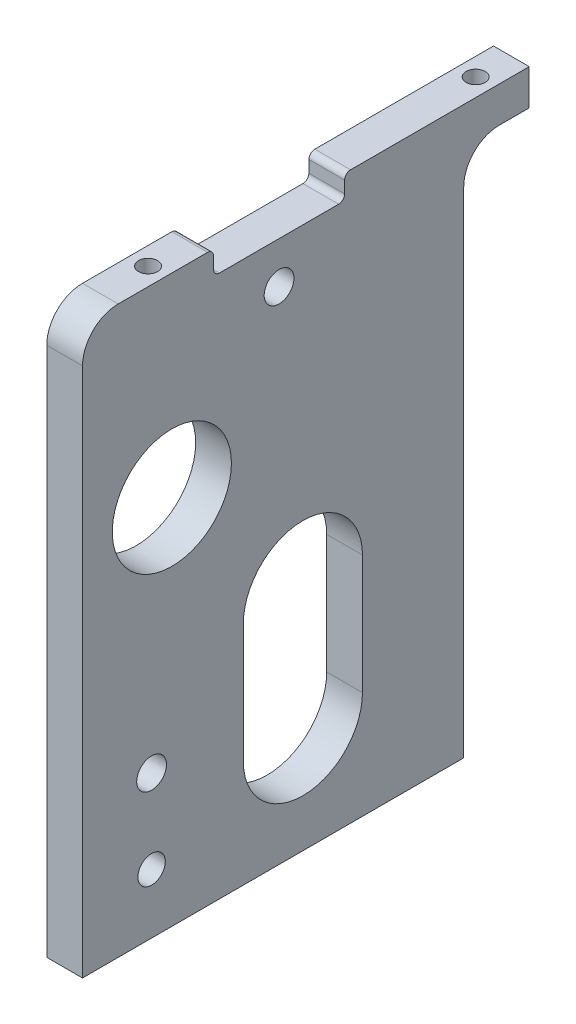
ISO-10303-21;
HEADER;
FILE_DESCRIPTION(('STEP AP214'),'2;1');
FILE_NAME('part.step','',(''),(''),'','','');
FILE_SCHEMA(('AUTOMOTIVE_DESIGN { 1 0 10303 214 1 1 1 1 }'));
ENDSEC;
DATA;
#1=APPLICATION_CONTEXT('core data for automotive mechanical design processes');
#2=APPLICATION_PROTOCOL_DEFINITION('international standard','automotive_design',2000,#1);
#3=PRODUCT_CONTEXT('',#1,'mechanical');
#4=PRODUCT('Part','Part','',(#3));
#5=PRODUCT_RELATED_PRODUCT_CATEGORY('part','',(#4));
#6=PRODUCT_DEFINITION_FORMATION('','',#4);
#7=PRODUCT_DEFINITION_CONTEXT('part definition',#1,'design');
#8=PRODUCT_DEFINITION('design','',#6,#7);
#9=PRODUCT_DEFINITION_SHAPE('','',#8);
#10=(LENGTH_UNIT() NAMED_UNIT(*) SI_UNIT(.MILLI.,.METRE.));
#11=(NAMED_UNIT(*) PLANE_ANGLE_UNIT() SI_UNIT($,.RADIAN.));
#12=(NAMED_UNIT(*) SI_UNIT($,.STERADIAN.) SOLID_ANGLE_UNIT());
#13=UNCERTAINTY_MEASURE_WITH_UNIT(LENGTH_MEASURE(1.E-05),#10,'distance_accuracy_value','');
#14=(GEOMETRIC_REPRESENTATION_CONTEXT(3) GLOBAL_UNCERTAINTY_ASSIGNED_CONTEXT((#13)) GLOBAL_UNIT_ASSIGNED_CONTEXT((#10,
#11,#12)) REPRESENTATION_CONTEXT('',''));
#15=CARTESIAN_POINT('',(0.,0.,0.));
#16=DIRECTION('',(0.,0.,1.));
#17=DIRECTION('',(1.,0.,0.));
#18=AXIS2_PLACEMENT_3D('',#15,#16,#17);
#19=CARTESIAN_POINT('',(1.5,23.75,16.5));
#20=DIRECTION('',(0.,-1.,0.));
#21=DIRECTION('',(0.,0.,-1.));
#22=AXIS2_PLACEMENT_3D('',#19,#20,#21);
#23=PLANE('',#22);
#24=CARTESIAN_POINT('',(0.,23.75,9.49999999999999));
#25=DIRECTION('',(0.,1.,0.));
#26=DIRECTION('',(0.,0.,1.));
#27=AXIS2_PLACEMENT_3D('',#24,#25,#26);
#28=CIRCLE('',#27,0.799999999999999);
#29=CARTESIAN_POINT('',(0.,23.75,10.3));
#30=VERTEX_POINT('',#29);
#31=EDGE_CURVE('E203',#30,#30,#28,.T.);
#32=ORIENTED_EDGE('',*,*,#31,.F.);
#33=EDGE_LOOP('',(#32));
#34=FACE_BOUND('',#33,.T.);
#35=DIRECTION('',(0.,0.,1.));
#36=VECTOR('',#35,1.);
#37=CARTESIAN_POINT('',(1.5,23.75,-15.5));
#38=LINE('',#37,#36);
#39=CARTESIAN_POINT('',(1.5,23.75,5.99999999999998));
#40=VERTEX_POINT('',#39);
#41=CARTESIAN_POINT('',(1.5,23.75,13.5));
#42=VERTEX_POINT('',#41);
#43=EDGE_CURVE('E293',#40,#42,#38,.T.);
#44=ORIENTED_EDGE('',*,*,#43,.F.);
#45=DIRECTION('',(1.,0.,0.));
#46=VECTOR('',#45,1.);
#47=CARTESIAN_POINT('',(1.5,23.75,5.99999999999998));
#48=LINE('',#47,#46);
#49=CARTESIAN_POINT('',(-1.5,23.75,5.99999999999998));
#50=VERTEX_POINT('',#49);
#51=EDGE_CURVE('E60',#40,#50,#48,.F.);
#52=ORIENTED_EDGE('',*,*,#51,.T.);
#53=DIRECTION('',(0.,0.,1.));
#54=VECTOR('',#53,1.);
#55=CARTESIAN_POINT('',(-1.5,23.75,16.5));
#56=LINE('',#55,#54);
#57=CARTESIAN_POINT('',(-1.5,23.75,13.5));
#58=VERTEX_POINT('',#57);
#59=EDGE_CURVE('E316',#50,#58,#56,.T.);
#60=ORIENTED_EDGE('',*,*,#59,.T.);
#61=DIRECTION('',(-1.,0.,0.));
#62=VECTOR('',#61,1.);
#63=CARTESIAN_POINT('',(1.5,23.75,13.5));
#64=LINE('',#63,#62);
#65=EDGE_CURVE('E354',#58,#42,#64,.F.);
#66=ORIENTED_EDGE('',*,*,#65,.T.);
#67=EDGE_LOOP('',(#44,#52,#60,#66));
#68=FACE_BOUND('',#67,.T.);
#69=ADVANCED_FACE('F44',(#34,#68),#23,.F.);
#70=CARTESIAN_POINT('',(1.5,0.,0.));
#71=DIRECTION('',(-1.,0.,0.));
#72=DIRECTION('',(0.,0.,1.));
#73=AXIS2_PLACEMENT_3D('',#70,#71,#72);
#74=PLANE('',#73);
#75=CARTESIAN_POINT('',(1.5,-11.75,10.7));
#76=DIRECTION('',(1.,0.,0.));
#77=DIRECTION('',(0.,0.,-1.));
#78=AXIS2_PLACEMENT_3D('',#75,#76,#77);
#79=CIRCLE('',#78,1.25);
#80=CARTESIAN_POINT('',(1.5,-11.75,9.44999999999998));
#81=VERTEX_POINT('',#80);
#82=EDGE_CURVE('E554',#81,#81,#79,.T.);
#83=ORIENTED_EDGE('',*,*,#82,.F.);
#84=EDGE_LOOP('',(#83));
#85=FACE_BOUND('',#84,.T.);
#86=CARTESIAN_POINT('',(1.5,18.25,0.));
#87=DIRECTION('',(1.,0.,0.));
#88=DIRECTION('',(0.,0.,-1.));
#89=AXIS2_PLACEMENT_3D('',#86,#87,#88);
#90=CIRCLE('',#89,1.25);
#91=CARTESIAN_POINT('',(1.5,18.25,-1.25000000000002));
#92=VERTEX_POINT('',#91);
#93=EDGE_CURVE('E562',#92,#92,#90,.T.);
#94=ORIENTED_EDGE('',*,*,#93,.F.);
#95=EDGE_LOOP('',(#94));
#96=FACE_BOUND('',#95,.T.);
#97=CARTESIAN_POINT('',(1.5,23.75,-21.));
#98=VERTEX_POINT('',#97);
#99=CARTESIAN_POINT('',(1.5,23.75,-6.00000000000002));
#100=VERTEX_POINT('',#99);
#101=EDGE_CURVE('E294',#98,#100,#38,.T.);
#102=ORIENTED_EDGE('',*,*,#101,.T.);
#103=CARTESIAN_POINT('',(1.5,23.2499999999999,-6.00000000000002));
#104=DIRECTION('',(-1.,0.,0.));
#105=DIRECTION('',(0.,0.,1.));
#106=AXIS2_PLACEMENT_3D('',#103,#104,#105);
#107=CIRCLE('',#106,0.5);
#108=CARTESIAN_POINT('',(1.5,23.2499999999999,-5.50000000000002));
#109=VERTEX_POINT('',#108);
#110=EDGE_CURVE('E514',#100,#109,#107,.F.);
#111=ORIENTED_EDGE('',*,*,#110,.T.);
#112=DIRECTION('',(0.,1.,0.));
#113=VECTOR('',#112,1.);
#114=CARTESIAN_POINT('',(1.5,23.75,-5.50000000000002));
#115=LINE('',#114,#113);
#116=CARTESIAN_POINT('',(1.5,22.25,-5.50000000000002));
#117=VERTEX_POINT('',#116);
#118=EDGE_CURVE('E543',#117,#109,#115,.T.);
#119=ORIENTED_EDGE('',*,*,#118,.F.);
#120=CARTESIAN_POINT('',(1.5,22.25,-5.00000000000002));
#121=DIRECTION('',(-1.,0.,0.));
#122=DIRECTION('',(0.,0.,1.));
#123=AXIS2_PLACEMENT_3D('',#120,#121,#122);
#124=CIRCLE('',#123,0.5);
#125=CARTESIAN_POINT('',(1.5,21.75,-5.00000000000002));
#126=VERTEX_POINT('',#125);
#127=EDGE_CURVE('E462',#117,#126,#124,.T.);
#128=ORIENTED_EDGE('',*,*,#127,.T.);
#129=DIRECTION('',(0.,0.,-1.));
#130=VECTOR('',#129,1.);
#131=CARTESIAN_POINT('',(1.5,21.75,5.49999999999998));
#132=LINE('',#131,#130);
#133=CARTESIAN_POINT('',(1.5,21.75,4.99999999999998));
#134=VERTEX_POINT('',#133);
#135=EDGE_CURVE('E482',#134,#126,#132,.T.);
#136=ORIENTED_EDGE('',*,*,#135,.F.);
#137=CARTESIAN_POINT('',(1.5,22.25,4.99999999999998));
#138=DIRECTION('',(-1.,0.,0.));
#139=DIRECTION('',(0.,0.,1.));
#140=AXIS2_PLACEMENT_3D('',#137,#138,#139);
#141=CIRCLE('',#140,0.5);
#142=CARTESIAN_POINT('',(1.5,22.25,5.49999999999998));
#143=VERTEX_POINT('',#142);
#144=EDGE_CURVE('E53',#134,#143,#141,.T.);
#145=ORIENTED_EDGE('',*,*,#144,.T.);
#146=DIRECTION('',(0.,-1.,0.));
#147=VECTOR('',#146,1.);
#148=CARTESIAN_POINT('',(1.5,23.75,5.49999999999998));
#149=LINE('',#148,#147);
#150=CARTESIAN_POINT('',(1.5,23.25,5.49999999999998));
#151=VERTEX_POINT('',#150);
#152=EDGE_CURVE('E481',#151,#143,#149,.T.);
#153=ORIENTED_EDGE('',*,*,#152,.F.);
#154=CARTESIAN_POINT('',(1.5,23.25,5.99999999999998));
#155=DIRECTION('',(-1.,0.,0.));
#156=DIRECTION('',(0.,0.,1.));
#157=AXIS2_PLACEMENT_3D('',#154,#155,#156);
#158=CIRCLE('',#157,0.5);
#159=EDGE_CURVE('E458',#151,#40,#158,.F.);
#160=ORIENTED_EDGE('',*,*,#159,.T.);
#161=ORIENTED_EDGE('',*,*,#43,.T.);
#162=CARTESIAN_POINT('',(1.5,20.75,13.5));
#163=DIRECTION('',(-1.,0.,0.));
#164=DIRECTION('',(0.,0.,1.));
#165=AXIS2_PLACEMENT_3D('',#162,#163,#164);
#166=CIRCLE('',#165,3.);
#167=CARTESIAN_POINT('',(1.5,20.75,16.5));
#168=VERTEX_POINT('',#167);
#169=EDGE_CURVE('E358',#42,#168,#166,.F.);
#170=ORIENTED_EDGE('',*,*,#169,.T.);
#171=DIRECTION('',(0.,-1.,0.));
#172=VECTOR('',#171,1.);
#173=CARTESIAN_POINT('',(1.5,-23.75,16.5));
#174=LINE('',#173,#172);
#175=CARTESIAN_POINT('',(1.5,-23.75,16.5));
#176=VERTEX_POINT('',#175);
#177=EDGE_CURVE('E298',#168,#176,#174,.T.);
#178=ORIENTED_EDGE('',*,*,#177,.T.);
#179=DIRECTION('',(0.,0.,-1.));
#180=VECTOR('',#179,1.);
#181=CARTESIAN_POINT('',(1.5,-23.75,15.5));
#182=LINE('',#181,#180);
#183=CARTESIAN_POINT('',(1.5,-23.75,-15.5));
#184=VERTEX_POINT('',#183);
#185=EDGE_CURVE('E279',#176,#184,#182,.T.);
#186=ORIENTED_EDGE('',*,*,#185,.T.);
#187=DIRECTION('',(0.,1.,0.));
#188=VECTOR('',#187,1.);
#189=CARTESIAN_POINT('',(1.5,8.25,-15.5));
#190=LINE('',#189,#188);
#191=CARTESIAN_POINT('',(1.5,17.75,-15.5));
#192=VERTEX_POINT('',#191);
#193=EDGE_CURVE('E282',#184,#192,#190,.T.);
#194=ORIENTED_EDGE('',*,*,#193,.T.);
#195=CARTESIAN_POINT('',(1.5,17.75,-18.5));
#196=DIRECTION('',(-1.,0.,0.));
#197=DIRECTION('',(0.,0.,1.));
#198=AXIS2_PLACEMENT_3D('',#195,#196,#197);
#199=CIRCLE('',#198,3.);
#200=CARTESIAN_POINT('',(1.5,20.75,-18.5));
#201=VERTEX_POINT('',#200);
#202=EDGE_CURVE('E364',#192,#201,#199,.T.);
#203=ORIENTED_EDGE('',*,*,#202,.T.);
#204=DIRECTION('',(0.,0.,-1.));
#205=VECTOR('',#204,1.);
#206=CARTESIAN_POINT('',(1.5,20.75,-21.));
#207=LINE('',#206,#205);
#208=CARTESIAN_POINT('',(1.5,20.75,-21.));
#209=VERTEX_POINT('',#208);
#210=EDGE_CURVE('E287',#201,#209,#207,.T.);
#211=ORIENTED_EDGE('',*,*,#210,.T.);
#212=DIRECTION('',(0.,1.,0.));
#213=VECTOR('',#212,1.);
#214=CARTESIAN_POINT('',(1.5,23.75,-21.));
#215=LINE('',#214,#213);
#216=EDGE_CURVE('E290',#209,#98,#215,.T.);
#217=ORIENTED_EDGE('',*,*,#216,.T.);
#218=EDGE_LOOP('',(#102,#111,#119,#128,#136,#145,#153,#160,#161,#170,#178,#186,#194,#203,#211,#217));
#219=FACE_BOUND('',#218,.T.);
#220=CARTESIAN_POINT('',(1.5,-4.75,-2.00000000000002));
#221=DIRECTION('',(1.,0.,0.));
#222=DIRECTION('',(0.,0.,-1.));
#223=AXIS2_PLACEMENT_3D('',#220,#221,#222);
#224=CIRCLE('',#223,5.);
#225=CARTESIAN_POINT('',(1.5,-4.75,-7.00000000000002));
#226=VERTEX_POINT('',#225);
#227=CARTESIAN_POINT('',(1.5,-4.75,2.99999999999998));
#228=VERTEX_POINT('',#227);
#229=EDGE_CURVE('E236',#226,#228,#224,.T.);
#230=ORIENTED_EDGE('',*,*,#229,.F.);
#231=DIRECTION('',(0.,1.,0.));
#232=VECTOR('',#231,1.);
#233=CARTESIAN_POINT('',(1.5,-4.75,-7.00000000000002));
#234=LINE('',#233,#232);
#235=CARTESIAN_POINT('',(1.5,-14.75,-7.00000000000001));
#236=VERTEX_POINT('',#235);
#237=EDGE_CURVE('E247',#236,#226,#234,.T.);
#238=ORIENTED_EDGE('',*,*,#237,.F.);
#239=CARTESIAN_POINT('',(1.5,-14.75,-2.00000000000001));
#240=DIRECTION('',(1.,0.,0.));
#241=DIRECTION('',(0.,0.,-1.));
#242=AXIS2_PLACEMENT_3D('',#239,#240,#241);
#243=CIRCLE('',#242,5.);
#244=CARTESIAN_POINT('',(1.5,-14.75,2.99999999999999));
#245=VERTEX_POINT('',#244);
#246=EDGE_CURVE('E243',#245,#236,#243,.T.);
#247=ORIENTED_EDGE('',*,*,#246,.F.);
#248=DIRECTION('',(0.,-1.,0.));
#249=VECTOR('',#248,1.);
#250=CARTESIAN_POINT('',(1.5,-4.75,2.99999999999998));
#251=LINE('',#250,#249);
#252=EDGE_CURVE('E239',#228,#245,#251,.T.);
#253=ORIENTED_EDGE('',*,*,#252,.F.);
#254=EDGE_LOOP('',(#230,#238,#247,#253));
#255=FACE_BOUND('',#254,.T.);
#256=CARTESIAN_POINT('',(1.5,7.422,8.99999999999998));
#257=DIRECTION('',(1.,0.,0.));
#258=DIRECTION('',(0.,0.,-1.));
#259=AXIS2_PLACEMENT_3D('',#256,#257,#258);
#260=CIRCLE('',#259,5.);
#261=CARTESIAN_POINT('',(1.5,7.422,3.99999999999998));
#262=VERTEX_POINT('',#261);
#263=EDGE_CURVE('E228',#262,#262,#260,.T.);
#264=ORIENTED_EDGE('',*,*,#263,.F.);
#265=EDGE_LOOP('',(#264));
#266=FACE_BOUND('',#265,.T.);
#267=CARTESIAN_POINT('',(1.5,-18.75,10.7));
#268=DIRECTION('',(1.,0.,0.));
#269=DIRECTION('',(0.,0.,-1.));
#270=AXIS2_PLACEMENT_3D('',#267,#268,#269);
#271=CIRCLE('',#270,1.15);
#272=CARTESIAN_POINT('',(1.5,-18.75,9.54999999999998));
#273=VERTEX_POINT('',#272);
#274=EDGE_CURVE('E220',#273,#273,#271,.T.);
#275=ORIENTED_EDGE('',*,*,#274,.F.);
#276=EDGE_LOOP('',(#275));
#277=FACE_BOUND('',#276,.T.);
#278=ADVANCED_FACE('F414',(#85,#96,#219,#255,#266,#277),#74,.F.);
#279=CARTESIAN_POINT('',(-1.5,0.,0.));
#280=DIRECTION('',(-1.,0.,0.));
#281=DIRECTION('',(0.,0.,1.));
#282=AXIS2_PLACEMENT_3D('',#279,#280,#281);
#283=PLANE('',#282);
#284=DIRECTION('',(0.,1.,0.));
#285=VECTOR('',#284,1.);
#286=CARTESIAN_POINT('',(-1.5,23.75,-5.50000000000002));
#287=LINE('',#286,#285);
#288=CARTESIAN_POINT('',(-1.5,22.25,-5.50000000000002));
#289=VERTEX_POINT('',#288);
#290=CARTESIAN_POINT('',(-1.5,23.2499999999999,-5.50000000000002));
#291=VERTEX_POINT('',#290);
#292=EDGE_CURVE('E537',#289,#291,#287,.T.);
#293=ORIENTED_EDGE('',*,*,#292,.T.);
#294=CARTESIAN_POINT('',(-1.5,23.2499999999999,-6.00000000000002));
#295=DIRECTION('',(-1.,0.,0.));
#296=DIRECTION('',(0.,0.,1.));
#297=AXIS2_PLACEMENT_3D('',#294,#295,#296);
#298=CIRCLE('',#297,0.5);
#299=CARTESIAN_POINT('',(-1.5,23.7499999999999,-6.00000000000003));
#300=VERTEX_POINT('',#299);
#301=EDGE_CURVE('E502',#291,#300,#298,.T.);
#302=ORIENTED_EDGE('',*,*,#301,.T.);
#303=CARTESIAN_POINT('',(-1.5,23.75,-21.));
#304=VERTEX_POINT('',#303);
#305=EDGE_CURVE('E317',#304,#300,#56,.T.);
#306=ORIENTED_EDGE('',*,*,#305,.F.);
#307=DIRECTION('',(0.,1.,0.));
#308=VECTOR('',#307,1.);
#309=CARTESIAN_POINT('',(-1.5,23.75,-21.));
#310=LINE('',#309,#308);
#311=CARTESIAN_POINT('',(-1.5,20.75,-21.));
#312=VERTEX_POINT('',#311);
#313=EDGE_CURVE('E312',#312,#304,#310,.T.);
#314=ORIENTED_EDGE('',*,*,#313,.F.);
#315=DIRECTION('',(0.,0.,-1.));
#316=VECTOR('',#315,1.);
#317=CARTESIAN_POINT('',(-1.5,20.75,-21.));
#318=LINE('',#317,#316);
#319=CARTESIAN_POINT('',(-1.5,20.75,-18.5));
#320=VERTEX_POINT('',#319);
#321=EDGE_CURVE('E309',#320,#312,#318,.T.);
#322=ORIENTED_EDGE('',*,*,#321,.F.);
#323=CARTESIAN_POINT('',(-1.5,17.75,-18.5));
#324=DIRECTION('',(-1.,0.,0.));
#325=DIRECTION('',(0.,0.,1.));
#326=AXIS2_PLACEMENT_3D('',#323,#324,#325);
#327=CIRCLE('',#326,3.);
#328=CARTESIAN_POINT('',(-1.5,17.75,-15.5));
#329=VERTEX_POINT('',#328);
#330=EDGE_CURVE('E361',#320,#329,#327,.F.);
#331=ORIENTED_EDGE('',*,*,#330,.T.);
#332=DIRECTION('',(0.,1.,0.));
#333=VECTOR('',#332,1.);
#334=CARTESIAN_POINT('',(-1.5,8.25,-15.5));
#335=LINE('',#334,#333);
#336=CARTESIAN_POINT('',(-1.5,-23.75,-15.5));
#337=VERTEX_POINT('',#336);
#338=EDGE_CURVE('E305',#337,#329,#335,.T.);
#339=ORIENTED_EDGE('',*,*,#338,.F.);
#340=DIRECTION('',(0.,0.,-1.));
#341=VECTOR('',#340,1.);
#342=CARTESIAN_POINT('',(-1.5,-23.75,15.5));
#343=LINE('',#342,#341);
#344=CARTESIAN_POINT('',(-1.5,-23.75,16.5));
#345=VERTEX_POINT('',#344);
#346=EDGE_CURVE('E278',#345,#337,#343,.T.);
#347=ORIENTED_EDGE('',*,*,#346,.F.);
#348=DIRECTION('',(0.,-1.,0.));
#349=VECTOR('',#348,1.);
#350=CARTESIAN_POINT('',(-1.5,-23.75,16.5));
#351=LINE('',#350,#349);
#352=CARTESIAN_POINT('',(-1.5,20.75,16.5));
#353=VERTEX_POINT('',#352);
#354=EDGE_CURVE('E283',#353,#345,#351,.T.);
#355=ORIENTED_EDGE('',*,*,#354,.F.);
#356=CARTESIAN_POINT('',(-1.5,20.75,13.5));
#357=DIRECTION('',(-1.,0.,0.));
#358=DIRECTION('',(0.,0.,1.));
#359=AXIS2_PLACEMENT_3D('',#356,#357,#358);
#360=CIRCLE('',#359,3.);
#361=EDGE_CURVE('E350',#353,#58,#360,.T.);
#362=ORIENTED_EDGE('',*,*,#361,.T.);
#363=ORIENTED_EDGE('',*,*,#59,.F.);
#364=CARTESIAN_POINT('',(-1.5,23.25,5.99999999999998));
#365=DIRECTION('',(-1.,0.,0.));
#366=DIRECTION('',(0.,0.,1.));
#367=AXIS2_PLACEMENT_3D('',#364,#365,#366);
#368=CIRCLE('',#367,0.5);
#369=CARTESIAN_POINT('',(-1.5,23.25,5.49999999999998));
#370=VERTEX_POINT('',#369);
#371=EDGE_CURVE('E460',#50,#370,#368,.T.);
#372=ORIENTED_EDGE('',*,*,#371,.T.);
#373=DIRECTION('',(0.,-1.,0.));
#374=VECTOR('',#373,1.);
#375=CARTESIAN_POINT('',(-1.5,23.75,5.49999999999998));
#376=LINE('',#375,#374);
#377=CARTESIAN_POINT('',(-1.5,22.25,5.49999999999998));
#378=VERTEX_POINT('',#377);
#379=EDGE_CURVE('E545',#370,#378,#376,.T.);
#380=ORIENTED_EDGE('',*,*,#379,.T.);
#381=CARTESIAN_POINT('',(-1.5,22.25,4.99999999999998));
#382=DIRECTION('',(-1.,0.,0.));
#383=DIRECTION('',(0.,0.,1.));
#384=AXIS2_PLACEMENT_3D('',#381,#382,#383);
#385=CIRCLE('',#384,0.5);
#386=CARTESIAN_POINT('',(-1.5,21.75,4.99999999999998));
#387=VERTEX_POINT('',#386);
#388=EDGE_CURVE('E11',#378,#387,#385,.F.);
#389=ORIENTED_EDGE('',*,*,#388,.T.);
#390=DIRECTION('',(0.,0.,-1.));
#391=VECTOR('',#390,1.);
#392=CARTESIAN_POINT('',(-1.5,21.75,5.49999999999998));
#393=LINE('',#392,#391);
#394=CARTESIAN_POINT('',(-1.5,21.75,-5.00000000000002));
#395=VERTEX_POINT('',#394);
#396=EDGE_CURVE('E550',#387,#395,#393,.T.);
#397=ORIENTED_EDGE('',*,*,#396,.T.);
#398=CARTESIAN_POINT('',(-1.5,22.25,-5.00000000000002));
#399=DIRECTION('',(-1.,0.,0.));
#400=DIRECTION('',(0.,0.,1.));
#401=AXIS2_PLACEMENT_3D('',#398,#399,#400);
#402=CIRCLE('',#401,0.5);
#403=EDGE_CURVE('E468',#395,#289,#402,.F.);
#404=ORIENTED_EDGE('',*,*,#403,.T.);
#405=EDGE_LOOP('',(#293,#302,#306,#314,#322,#331,#339,#347,#355,#362,#363,#372,#380,#389,#397,#404));
#406=FACE_BOUND('',#405,.T.);
#407=CARTESIAN_POINT('',(-1.5,-11.75,10.7));
#408=DIRECTION('',(1.,0.,0.));
#409=DIRECTION('',(0.,0.,-1.));
#410=AXIS2_PLACEMENT_3D('',#407,#408,#409);
#411=CIRCLE('',#410,1.25);
#412=CARTESIAN_POINT('',(-1.5,-11.75,9.44999999999998));
#413=VERTEX_POINT('',#412);
#414=EDGE_CURVE('E558',#413,#413,#411,.T.);
#415=ORIENTED_EDGE('',*,*,#414,.T.);
#416=EDGE_LOOP('',(#415));
#417=FACE_BOUND('',#416,.T.);
#418=CARTESIAN_POINT('',(-1.5,18.25,0.));
#419=DIRECTION('',(1.,0.,0.));
#420=DIRECTION('',(0.,0.,-1.));
#421=AXIS2_PLACEMENT_3D('',#418,#419,#420);
#422=CIRCLE('',#421,1.25);
#423=CARTESIAN_POINT('',(-1.5,18.25,-1.25000000000002));
#424=VERTEX_POINT('',#423);
#425=EDGE_CURVE('E212',#424,#424,#422,.T.);
#426=ORIENTED_EDGE('',*,*,#425,.T.);
#427=EDGE_LOOP('',(#426));
#428=FACE_BOUND('',#427,.T.);
#429=CARTESIAN_POINT('',(-1.5,7.422,8.99999999999998));
#430=DIRECTION('',(1.,0.,0.));
#431=DIRECTION('',(0.,0.,-1.));
#432=AXIS2_PLACEMENT_3D('',#429,#430,#431);
#433=CIRCLE('',#432,5.);
#434=CARTESIAN_POINT('',(-1.5,7.422,3.99999999999998));
#435=VERTEX_POINT('',#434);
#436=EDGE_CURVE('E224',#435,#435,#433,.T.);
#437=ORIENTED_EDGE('',*,*,#436,.T.);
#438=EDGE_LOOP('',(#437));
#439=FACE_BOUND('',#438,.T.);
#440=DIRECTION('',(0.,1.,0.));
#441=VECTOR('',#440,1.);
#442=CARTESIAN_POINT('',(-1.5,-4.75,-7.00000000000002));
#443=LINE('',#442,#441);
#444=CARTESIAN_POINT('',(-1.5,-14.75,-7.00000000000001));
#445=VERTEX_POINT('',#444);
#446=CARTESIAN_POINT('',(-1.5,-4.75,-7.00000000000002));
#447=VERTEX_POINT('',#446);
#448=EDGE_CURVE('E240',#445,#447,#443,.T.);
#449=ORIENTED_EDGE('',*,*,#448,.T.);
#450=CARTESIAN_POINT('',(-1.5,-4.75,-2.00000000000002));
#451=DIRECTION('',(1.,0.,0.));
#452=DIRECTION('',(0.,0.,-1.));
#453=AXIS2_PLACEMENT_3D('',#450,#451,#452);
#454=CIRCLE('',#453,5.);
#455=CARTESIAN_POINT('',(-1.5,-4.75,2.99999999999998));
#456=VERTEX_POINT('',#455);
#457=EDGE_CURVE('E232',#447,#456,#454,.T.);
#458=ORIENTED_EDGE('',*,*,#457,.T.);
#459=DIRECTION('',(0.,-1.,0.));
#460=VECTOR('',#459,1.);
#461=CARTESIAN_POINT('',(-1.5,-4.75,2.99999999999998));
#462=LINE('',#461,#460);
#463=CARTESIAN_POINT('',(-1.5,-14.75,2.99999999999999));
#464=VERTEX_POINT('',#463);
#465=EDGE_CURVE('E254',#456,#464,#462,.T.);
#466=ORIENTED_EDGE('',*,*,#465,.T.);
#467=CARTESIAN_POINT('',(-1.5,-14.75,-2.00000000000001));
#468=DIRECTION('',(1.,0.,0.));
#469=DIRECTION('',(0.,0.,-1.));
#470=AXIS2_PLACEMENT_3D('',#467,#468,#469);
#471=CIRCLE('',#470,5.);
#472=EDGE_CURVE('E258',#464,#445,#471,.T.);
#473=ORIENTED_EDGE('',*,*,#472,.T.);
#474=EDGE_LOOP('',(#449,#458,#466,#473));
#475=FACE_BOUND('',#474,.T.);
#476=CARTESIAN_POINT('',(-1.5,-18.75,10.7));
#477=DIRECTION('',(1.,0.,0.));
#478=DIRECTION('',(0.,0.,-1.));
#479=AXIS2_PLACEMENT_3D('',#476,#477,#478);
#480=CIRCLE('',#479,1.15);
#481=CARTESIAN_POINT('',(-1.5,-18.75,9.54999999999998));
#482=VERTEX_POINT('',#481);
#483=EDGE_CURVE('E219',#482,#482,#480,.T.);
#484=ORIENTED_EDGE('',*,*,#483,.T.);
#485=EDGE_LOOP('',(#484));
#486=FACE_BOUND('',#485,.T.);
#487=ADVANCED_FACE('F417',(#406,#417,#428,#439,#475,#486),#283,.T.);
#488=CARTESIAN_POINT('',(1.5,-23.75,15.5));
#489=DIRECTION('',(0.,1.,0.));
#490=DIRECTION('',(0.,0.,1.));
#491=AXIS2_PLACEMENT_3D('',#488,#489,#490);
#492=PLANE('',#491);
#493=ORIENTED_EDGE('',*,*,#346,.T.);
#494=DIRECTION('',(-1.,0.,0.));
#495=VECTOR('',#494,1.);
#496=CARTESIAN_POINT('',(1.5,-23.75,-15.5));
#497=LINE('',#496,#495);
#498=EDGE_CURVE('E334',#184,#337,#497,.T.);
#499=ORIENTED_EDGE('',*,*,#498,.F.);
#500=ORIENTED_EDGE('',*,*,#185,.F.);
#501=DIRECTION('',(-1.,0.,0.));
#502=VECTOR('',#501,1.);
#503=CARTESIAN_POINT('',(1.5,-23.75,16.5));
#504=LINE('',#503,#502);
#505=EDGE_CURVE('E301',#176,#345,#504,.T.);
#506=ORIENTED_EDGE('',*,*,#505,.T.);
#507=EDGE_LOOP('',(#493,#499,#500,#506));
#508=FACE_BOUND('',#507,.T.);
#509=ADVANCED_FACE('F421',(#508),#492,.F.);
#510=CARTESIAN_POINT('',(1.5,8.25,-15.5));
#511=DIRECTION('',(0.,0.,1.));
#512=DIRECTION('',(0.,-1.,0.));
#513=AXIS2_PLACEMENT_3D('',#510,#511,#512);
#514=PLANE('',#513);
#515=ORIENTED_EDGE('',*,*,#338,.T.);
#516=DIRECTION('',(-1.,0.,0.));
#517=VECTOR('',#516,1.);
#518=CARTESIAN_POINT('',(1.5,17.75,-15.5));
#519=LINE('',#518,#517);
#520=EDGE_CURVE('E343',#329,#192,#519,.F.);
#521=ORIENTED_EDGE('',*,*,#520,.T.);
#522=ORIENTED_EDGE('',*,*,#193,.F.);
#523=ORIENTED_EDGE('',*,*,#498,.T.);
#524=EDGE_LOOP('',(#515,#521,#522,#523));
#525=FACE_BOUND('',#524,.T.);
#526=ADVANCED_FACE('F437',(#525),#514,.F.);
#527=CARTESIAN_POINT('',(1.5,20.75,-21.));
#528=DIRECTION('',(0.,1.,0.));
#529=DIRECTION('',(0.,0.,1.));
#530=AXIS2_PLACEMENT_3D('',#527,#528,#529);
#531=PLANE('',#530);
#532=DIRECTION('',(-1.,0.,0.));
#533=VECTOR('',#532,1.);
#534=CARTESIAN_POINT('',(-1.5,20.75,-18.5));
#535=LINE('',#534,#533);
#536=CARTESIAN_POINT('',(0.624499799839827,20.75,-18.5));
#537=VERTEX_POINT('',#536);
#538=EDGE_CURVE('E339',#201,#537,#535,.T.);
#539=ORIENTED_EDGE('',*,*,#538,.T.);
#540=CARTESIAN_POINT('',(0.,20.75,-18.));
#541=DIRECTION('',(0.,1.,0.));
#542=DIRECTION('',(0.,0.,1.));
#543=AXIS2_PLACEMENT_3D('',#540,#541,#542);
#544=CIRCLE('',#543,0.799999999999999);
#545=CARTESIAN_POINT('',(-0.624499799839827,20.75,-18.5));
#546=VERTEX_POINT('',#545);
#547=EDGE_CURVE('E209',#537,#546,#544,.T.);
#548=ORIENTED_EDGE('',*,*,#547,.T.);
#549=EDGE_CURVE('E338',#546,#320,#535,.T.);
#550=ORIENTED_EDGE('',*,*,#549,.T.);
#551=ORIENTED_EDGE('',*,*,#321,.T.);
#552=DIRECTION('',(-1.,0.,0.));
#553=VECTOR('',#552,1.);
#554=CARTESIAN_POINT('',(1.5,20.75,-21.));
#555=LINE('',#554,#553);
#556=EDGE_CURVE('E330',#209,#312,#555,.T.);
#557=ORIENTED_EDGE('',*,*,#556,.F.);
#558=ORIENTED_EDGE('',*,*,#210,.F.);
#559=EDGE_LOOP('',(#539,#548,#550,#551,#557,#558));
#560=FACE_BOUND('',#559,.T.);
#561=ADVANCED_FACE('F433',(#560),#531,.F.);
#562=CARTESIAN_POINT('',(1.5,23.75,-21.));
#563=DIRECTION('',(0.,0.,1.));
#564=DIRECTION('',(0.,-1.,0.));
#565=AXIS2_PLACEMENT_3D('',#562,#563,#564);
#566=PLANE('',#565);
#567=ORIENTED_EDGE('',*,*,#313,.T.);
#568=DIRECTION('',(-1.,0.,0.));
#569=VECTOR('',#568,1.);
#570=CARTESIAN_POINT('',(1.5,23.75,-21.));
#571=LINE('',#570,#569);
#572=EDGE_CURVE('E326',#98,#304,#571,.T.);
#573=ORIENTED_EDGE('',*,*,#572,.F.);
#574=ORIENTED_EDGE('',*,*,#216,.F.);
#575=ORIENTED_EDGE('',*,*,#556,.T.);
#576=EDGE_LOOP('',(#567,#573,#574,#575));
#577=FACE_BOUND('',#576,.T.);
#578=ADVANCED_FACE('F429',(#577),#566,.F.);
#579=CARTESIAN_POINT('',(0.,23.7499999999999,-18.));
#580=DIRECTION('',(0.,1.,0.));
#581=DIRECTION('',(0.,0.,1.));
#582=AXIS2_PLACEMENT_3D('',#579,#580,#581);
#583=CIRCLE('',#582,0.799999999999999);
#584=CARTESIAN_POINT('',(0.,23.7499999999999,-17.2));
#585=VERTEX_POINT('',#584);
#586=EDGE_CURVE('E202',#585,#585,#583,.T.);
#587=ORIENTED_EDGE('',*,*,#586,.F.);
#588=EDGE_LOOP('',(#587));
#589=FACE_BOUND('',#588,.T.);
#590=ORIENTED_EDGE('',*,*,#305,.T.);
#591=DIRECTION('',(1.,0.,0.));
#592=VECTOR('',#591,1.);
#593=CARTESIAN_POINT('',(1.5,23.7499999999999,-6.00000000000003));
#594=LINE('',#593,#592);
#595=EDGE_CURVE('E377',#300,#100,#594,.T.);
#596=ORIENTED_EDGE('',*,*,#595,.T.);
#597=ORIENTED_EDGE('',*,*,#101,.F.);
#598=ORIENTED_EDGE('',*,*,#572,.T.);
#599=EDGE_LOOP('',(#590,#596,#597,#598));
#600=FACE_BOUND('',#599,.T.);
#601=ADVANCED_FACE('F425',(#589,#600),#23,.F.);
#602=CARTESIAN_POINT('',(1.5,-23.75,16.5));
#603=DIRECTION('',(0.,0.,-1.));
#604=DIRECTION('',(-1.,0.,0.));
#605=AXIS2_PLACEMENT_3D('',#602,#603,#604);
#606=PLANE('',#605);
#607=ORIENTED_EDGE('',*,*,#177,.F.);
#608=DIRECTION('',(-1.,0.,0.));
#609=VECTOR('',#608,1.);
#610=CARTESIAN_POINT('',(1.5,20.75,16.5));
#611=LINE('',#610,#609);
#612=EDGE_CURVE('E346',#168,#353,#611,.T.);
#613=ORIENTED_EDGE('',*,*,#612,.T.);
#614=ORIENTED_EDGE('',*,*,#354,.T.);
#615=ORIENTED_EDGE('',*,*,#505,.F.);
#616=EDGE_LOOP('',(#607,#613,#614,#615));
#617=FACE_BOUND('',#616,.T.);
#618=ADVANCED_FACE('F412',(#617),#606,.F.);
#619=CARTESIAN_POINT('',(1.5,-4.75,-2.00000000000002));
#620=DIRECTION('',(-1.,0.,0.));
#621=DIRECTION('',(0.,0.,1.));
#622=AXIS2_PLACEMENT_3D('',#619,#620,#621);
#623=CYLINDRICAL_SURFACE('',#622,5.);
#624=ORIENTED_EDGE('',*,*,#457,.F.);
#625=DIRECTION('',(-1.,0.,0.));
#626=VECTOR('',#625,1.);
#627=CARTESIAN_POINT('',(1.5,-4.75,-7.00000000000002));
#628=LINE('',#627,#626);
#629=EDGE_CURVE('E250',#226,#447,#628,.T.);
#630=ORIENTED_EDGE('',*,*,#629,.F.);
#631=ORIENTED_EDGE('',*,*,#229,.T.);
#632=DIRECTION('',(-1.,0.,0.));
#633=VECTOR('',#632,1.);
#634=CARTESIAN_POINT('',(1.5,-4.75,2.99999999999998));
#635=LINE('',#634,#633);
#636=EDGE_CURVE('E274',#228,#456,#635,.T.);
#637=ORIENTED_EDGE('',*,*,#636,.T.);
#638=EDGE_LOOP('',(#624,#630,#631,#637));
#639=FACE_BOUND('',#638,.T.);
#640=ADVANCED_FACE('F408',(#639),#623,.F.);
#641=CARTESIAN_POINT('',(1.5,-4.75,2.99999999999998));
#642=DIRECTION('',(0.,0.,-1.));
#643=DIRECTION('',(0.,1.,0.));
#644=AXIS2_PLACEMENT_3D('',#641,#642,#643);
#645=PLANE('',#644);
#646=ORIENTED_EDGE('',*,*,#465,.F.);
#647=ORIENTED_EDGE('',*,*,#636,.F.);
#648=ORIENTED_EDGE('',*,*,#252,.T.);
#649=DIRECTION('',(-1.,0.,0.));
#650=VECTOR('',#649,1.);
#651=CARTESIAN_POINT('',(1.5,-14.75,2.99999999999999));
#652=LINE('',#651,#650);
#653=EDGE_CURVE('E271',#245,#464,#652,.T.);
#654=ORIENTED_EDGE('',*,*,#653,.T.);
#655=EDGE_LOOP('',(#646,#647,#648,#654));
#656=FACE_BOUND('',#655,.T.);
#657=ADVANCED_FACE('F404',(#656),#645,.T.);
#658=CARTESIAN_POINT('',(1.5,-14.75,-2.00000000000001));
#659=DIRECTION('',(-1.,0.,0.));
#660=DIRECTION('',(0.,0.,1.));
#661=AXIS2_PLACEMENT_3D('',#658,#659,#660);
#662=CYLINDRICAL_SURFACE('',#661,5.);
#663=ORIENTED_EDGE('',*,*,#472,.F.);
#664=ORIENTED_EDGE('',*,*,#653,.F.);
#665=ORIENTED_EDGE('',*,*,#246,.T.);
#666=DIRECTION('',(-1.,0.,0.));
#667=VECTOR('',#666,1.);
#668=CARTESIAN_POINT('',(1.5,-14.75,-7.00000000000001));
#669=LINE('',#668,#667);
#670=EDGE_CURVE('E268',#236,#445,#669,.T.);
#671=ORIENTED_EDGE('',*,*,#670,.T.);
#672=EDGE_LOOP('',(#663,#664,#665,#671));
#673=FACE_BOUND('',#672,.T.);
#674=ADVANCED_FACE('F400',(#673),#662,.F.);
#675=CARTESIAN_POINT('',(1.5,-4.75,-7.00000000000002));
#676=DIRECTION('',(0.,0.,1.));
#677=DIRECTION('',(0.,-1.,0.));
#678=AXIS2_PLACEMENT_3D('',#675,#676,#677);
#679=PLANE('',#678);
#680=ORIENTED_EDGE('',*,*,#448,.F.);
#681=ORIENTED_EDGE('',*,*,#670,.F.);
#682=ORIENTED_EDGE('',*,*,#237,.T.);
#683=ORIENTED_EDGE('',*,*,#629,.T.);
#684=EDGE_LOOP('',(#680,#681,#682,#683));
#685=FACE_BOUND('',#684,.T.);
#686=ADVANCED_FACE('F396',(#685),#679,.T.);
#687=CARTESIAN_POINT('',(1.5,7.422,8.99999999999998));
#688=DIRECTION('',(-1.,0.,0.));
#689=DIRECTION('',(0.,0.,1.));
#690=AXIS2_PLACEMENT_3D('',#687,#688,#689);
#691=CYLINDRICAL_SURFACE('',#690,5.);
#692=ORIENTED_EDGE('',*,*,#263,.T.);
#693=EDGE_LOOP('',(#692));
#694=FACE_BOUND('',#693,.T.);
#695=ORIENTED_EDGE('',*,*,#436,.F.);
#696=EDGE_LOOP('',(#695));
#697=FACE_BOUND('',#696,.T.);
#698=ADVANCED_FACE('F392',(#694,#697),#691,.F.);
#699=CARTESIAN_POINT('',(1.5,-18.75,10.7));
#700=DIRECTION('',(-1.,0.,0.));
#701=DIRECTION('',(0.,0.,1.));
#702=AXIS2_PLACEMENT_3D('',#699,#700,#701);
#703=CYLINDRICAL_SURFACE('',#702,1.15);
#704=ORIENTED_EDGE('',*,*,#274,.T.);
#705=EDGE_LOOP('',(#704));
#706=FACE_BOUND('',#705,.T.);
#707=ORIENTED_EDGE('',*,*,#483,.F.);
#708=EDGE_LOOP('',(#707));
#709=FACE_BOUND('',#708,.T.);
#710=ADVANCED_FACE('F389',(#706,#709),#703,.F.);
#711=CARTESIAN_POINT('',(1.5,17.75,-18.5));
#712=DIRECTION('',(1.,0.,0.));
#713=DIRECTION('',(0.,0.,-1.));
#714=AXIS2_PLACEMENT_3D('',#711,#712,#713);
#715=CYLINDRICAL_SURFACE('',#714,3.);
#716=ORIENTED_EDGE('',*,*,#549,.F.);
#717=CARTESIAN_POINT('',(-0.624499799839827,20.75,-18.5));
#718=CARTESIAN_POINT('',(-0.652014048700827,20.7500229284472,-18.4657045167367));
#719=CARTESIAN_POINT('',(-0.676631613351037,20.7494137750967,-18.4290918878501));
#720=CARTESIAN_POINT('',(-0.719518559701675,20.7466069145968,-18.352422496548));
#721=CARTESIAN_POINT('',(-0.737794103847447,20.7444107559503,-18.3123691249414));
#722=CARTESIAN_POINT('',(-0.767510649394447,20.7381040985534,-18.2299016648038));
#723=CARTESIAN_POINT('',(-0.778945765329119,20.7339919566966,-18.1874855776014));
#724=CARTESIAN_POINT('',(-0.794719777497365,20.7237438678252,-18.1016108779067));
#725=CARTESIAN_POINT('',(-0.799060890582344,20.7176085537654,-18.058152595406));
#726=CARTESIAN_POINT('',(-0.800664733040897,20.7034033381949,-17.9714772817413));
#727=CARTESIAN_POINT('',(-0.797935010883336,20.6953355080876,-17.9282600426226));
#728=CARTESIAN_POINT('',(-0.785652169062283,20.677532273898,-17.8431537712503));
#729=CARTESIAN_POINT('',(-0.776096344164906,20.6677962098456,-17.8012652724621));
#730=CARTESIAN_POINT('',(-0.750085035413154,20.6467074794924,-17.7183465331588));
#731=CARTESIAN_POINT('',(-0.73339136277349,20.6353089123482,-17.6774028464172));
#732=CARTESIAN_POINT('',(-0.693620637873306,20.611786724723,-17.5989696591209));
#733=CARTESIAN_POINT('',(-0.670542006329612,20.5996629254421,-17.5614810162139));
#734=CARTESIAN_POINT('',(-0.617245525760255,20.5747828110391,-17.4889884786824));
#735=CARTESIAN_POINT('',(-0.586725225885355,20.5620255685968,-17.45420668395));
#736=CARTESIAN_POINT('',(-0.519951021339486,20.5374080323287,-17.390255482869));
#737=CARTESIAN_POINT('',(-0.483695869940854,20.5255479343681,-17.3610872999546));
#738=CARTESIAN_POINT('',(-0.406268963074014,20.5037144316325,-17.3092651542304));
#739=CARTESIAN_POINT('',(-0.3650974498375,20.4937409339662,-17.2866108706645));
#740=CARTESIAN_POINT('',(-0.278921950964374,20.4766735005142,-17.2487256807609));
#741=CARTESIAN_POINT('',(-0.233920941573974,20.4695773527675,-17.2334890702767));
#742=CARTESIAN_POINT('',(-0.145175507685046,20.4594935157028,-17.2120657271114));
#743=CARTESIAN_POINT('',(-0.101612864737736,20.456225442962,-17.2052589183727));
#744=CARTESIAN_POINT('',(-0.013847869358133,20.4531806279022,-17.1989125127868));
#745=CARTESIAN_POINT('',(0.0303541684918919,20.4534022233735,-17.1993694560472));
#746=CARTESIAN_POINT('',(0.114748943035274,20.4571639312167,-17.2072207371721));
#747=CARTESIAN_POINT('',(0.155000840833804,20.4604634437075,-17.2141121312685));
#748=CARTESIAN_POINT('',(0.233700631239304,20.4697258124695,-17.2338211286254));
#749=CARTESIAN_POINT('',(0.272148297201892,20.4756890023627,-17.2466394742356));
#750=CARTESIAN_POINT('',(0.347220182355918,20.489940159646,-17.2781033795463));
#751=CARTESIAN_POINT('',(0.383778842864164,20.4982802922399,-17.2968809113573));
#752=CARTESIAN_POINT('',(0.4533168706352,20.516574886654,-17.3395682947538));
#753=CARTESIAN_POINT('',(0.486294939573728,20.5265299308002,-17.3634799986968));
#754=CARTESIAN_POINT('',(0.550797669592584,20.5483057590128,-17.4181393289113));
#755=CARTESIAN_POINT('',(0.581941078173061,20.5602136037268,-17.4493026065376));
#756=CARTESIAN_POINT('',(0.638670466049603,20.5843388650124,-17.5162374091961));
#757=CARTESIAN_POINT('',(0.664254351008361,20.5965563963179,-17.5520106628037));
#758=CARTESIAN_POINT('',(0.710613445185246,20.6212666886461,-17.6296097578264));
#759=CARTESIAN_POINT('',(0.731015023908129,20.6337330305724,-17.6716683761901));
#760=CARTESIAN_POINT('',(0.764268675490771,20.6574007866937,-17.7590103975881));
#761=CARTESIAN_POINT('',(0.777121436197136,20.668602316063,-17.8042935063858));
#762=CARTESIAN_POINT('',(0.794556617725306,20.6889349408886,-17.8959918877298));
#763=CARTESIAN_POINT('',(0.799284843367512,20.6980999102158,-17.9423717183643));
#764=CARTESIAN_POINT('',(0.800563911544977,20.7142192393039,-18.0356291251341));
#765=CARTESIAN_POINT('',(0.797117136250359,20.7211742423725,-18.0825065523083));
#766=CARTESIAN_POINT('',(0.782388302371133,20.7324296349357,-18.1727744393022));
#767=CARTESIAN_POINT('',(0.771525598381927,20.7368498700038,-18.2162190197147));
#768=CARTESIAN_POINT('',(0.742634242230942,20.743680202914,-18.3008109440981));
#769=CARTESIAN_POINT('',(0.724611274722271,20.7460918906838,-18.341960080976));
#770=CARTESIAN_POINT('',(0.691943618350677,20.7484798719856,-18.4022221376236));
#771=CARTESIAN_POINT('',(0.679668438112064,20.7490677530379,-18.4226315945346));
#772=CARTESIAN_POINT('',(0.653371398086428,20.7498276768607,-18.462243989218));
#773=CARTESIAN_POINT('',(0.639352956699239,20.7500005203746,-18.481449180545));
#774=CARTESIAN_POINT('',(0.624499799839827,20.75,-18.5));
#775=B_SPLINE_CURVE_WITH_KNOTS('',3,(#717,#718,#719,#720,#721,#722,#723,#724,#725,#726,#727,
#728,#729,#730,#731,#732,#733,#734,#735,#736,#737,#738,#739,#740,#741,#742,#743,#744,#745,#746,
#747,#748,#749,#750,#751,#752,#753,#754,#755,#756,#757,#758,#759,#760,#761,#762,#763,#764,#765,
#766,#767,#768,#769,#770,#771,#772,#773,#774),.UNSPECIFIED.,.F.,.F.,(4,2,2,2,2,2,2,2,2,2,2,2,2,
2,2,2,2,2,2,2,2,2,2,2,2,2,2,2,4),(0.,0.13174557508212,0.263362774156823,0.395093053667684,
0.526782160043372,0.658330739691202,0.789931481936341,0.926316176458657,1.06273463516327,
1.20606427784292,1.34942512259293,1.49277890679203,1.63602227796748,1.76794451868265,
1.89980392368298,2.02214906873471,2.14450954164847,2.26979498508866,2.39512570643643,
2.53145043814881,2.66782643628914,2.81226361585426,2.95668763229331,3.09849160869448,
3.24025426893013,3.37460029714001,3.50883987825194,3.58022469238289,3.65147167077707),.UNSPECIFIED.);
#776=EDGE_CURVE('E367',#546,#537,#775,.T.);
#777=ORIENTED_EDGE('',*,*,#776,.T.);
#778=ORIENTED_EDGE('',*,*,#538,.F.);
#779=ORIENTED_EDGE('',*,*,#202,.F.);
#780=ORIENTED_EDGE('',*,*,#520,.F.);
#781=ORIENTED_EDGE('',*,*,#330,.F.);
#782=EDGE_LOOP('',(#716,#777,#778,#779,#780,#781));
#783=FACE_BOUND('',#782,.T.);
#784=ADVANCED_FACE('F379',(#783),#715,.F.);
#785=CARTESIAN_POINT('',(1.5,20.75,13.5));
#786=DIRECTION('',(-1.,0.,0.));
#787=DIRECTION('',(0.,0.,1.));
#788=AXIS2_PLACEMENT_3D('',#785,#786,#787);
#789=CYLINDRICAL_SURFACE('',#788,3.);
#790=ORIENTED_EDGE('',*,*,#169,.F.);
#791=ORIENTED_EDGE('',*,*,#65,.F.);
#792=ORIENTED_EDGE('',*,*,#361,.F.);
#793=ORIENTED_EDGE('',*,*,#612,.F.);
#794=EDGE_LOOP('',(#790,#791,#792,#793));
#795=FACE_BOUND('',#794,.T.);
#796=ADVANCED_FACE('F386',(#795),#789,.T.);
#797=CARTESIAN_POINT('',(0.,23.7499999999999,-18.));
#798=DIRECTION('',(0.,1.,0.));
#799=DIRECTION('',(0.,0.,1.));
#800=AXIS2_PLACEMENT_3D('',#797,#798,#799);
#801=CYLINDRICAL_SURFACE('',#800,0.799999999999999);
#802=ORIENTED_EDGE('',*,*,#586,.T.);
#803=EDGE_LOOP('',(#802));
#804=FACE_BOUND('',#803,.T.);
#805=ORIENTED_EDGE('',*,*,#776,.F.);
#806=ORIENTED_EDGE('',*,*,#547,.F.);
#807=EDGE_LOOP('',(#805,#806));
#808=FACE_BOUND('',#807,.T.);
#809=ADVANCED_FACE('F195',(#804,#808),#801,.F.);
#810=CARTESIAN_POINT('',(0.,17.75,9.50000000000001));
#811=DIRECTION('',(0.,1.,0.));
#812=DIRECTION('',(0.,0.,1.));
#813=AXIS2_PLACEMENT_3D('',#810,#811,#812);
#814=CONICAL_SURFACE('',#813,0.799999999999999,1.02974425867665);
#815=CARTESIAN_POINT('',(0.,17.2693115047779,9.50000000000002));
#816=VERTEX_POINT('',#815);
#817=VERTEX_LOOP('',#816);
#818=FACE_BOUND('',#817,.T.);
#819=CARTESIAN_POINT('',(0.,17.75,9.50000000000001));
#820=DIRECTION('',(0.,1.,0.));
#821=DIRECTION('',(0.,0.,1.));
#822=AXIS2_PLACEMENT_3D('',#819,#820,#821);
#823=CIRCLE('',#822,0.799999999999999);
#824=CARTESIAN_POINT('',(0.,17.75,10.3));
#825=VERTEX_POINT('',#824);
#826=EDGE_CURVE('E199',#825,#825,#823,.T.);
#827=ORIENTED_EDGE('',*,*,#826,.T.);
#828=EDGE_LOOP('',(#827));
#829=FACE_BOUND('',#828,.T.);
#830=ADVANCED_FACE('F191',(#818,#829),#814,.F.);
#831=CARTESIAN_POINT('',(0.,23.75,9.49999999999999));
#832=DIRECTION('',(0.,1.,0.));
#833=DIRECTION('',(0.,0.,1.));
#834=AXIS2_PLACEMENT_3D('',#831,#832,#833);
#835=CYLINDRICAL_SURFACE('',#834,0.799999999999999);
#836=ORIENTED_EDGE('',*,*,#826,.F.);
#837=EDGE_LOOP('',(#836));
#838=FACE_BOUND('',#837,.T.);
#839=ORIENTED_EDGE('',*,*,#31,.T.);
#840=EDGE_LOOP('',(#839));
#841=FACE_BOUND('',#840,.T.);
#842=ADVANCED_FACE('F194',(#838,#841),#835,.F.);
#843=CARTESIAN_POINT('',(1.5,18.25,0.));
#844=DIRECTION('',(1.,0.,0.));
#845=DIRECTION('',(0.,0.,-1.));
#846=AXIS2_PLACEMENT_3D('',#843,#844,#845);
#847=CYLINDRICAL_SURFACE('',#846,1.25);
#848=ORIENTED_EDGE('',*,*,#425,.F.);
#849=EDGE_LOOP('',(#848));
#850=FACE_BOUND('',#849,.T.);
#851=ORIENTED_EDGE('',*,*,#93,.T.);
#852=EDGE_LOOP('',(#851));
#853=FACE_BOUND('',#852,.T.);
#854=ADVANCED_FACE('F572',(#850,#853),#847,.F.);
#855=CARTESIAN_POINT('',(1.5,-11.75,10.7));
#856=DIRECTION('',(1.,0.,0.));
#857=DIRECTION('',(0.,0.,-1.));
#858=AXIS2_PLACEMENT_3D('',#855,#856,#857);
#859=CYLINDRICAL_SURFACE('',#858,1.25);
#860=ORIENTED_EDGE('',*,*,#414,.F.);
#861=EDGE_LOOP('',(#860));
#862=FACE_BOUND('',#861,.T.);
#863=ORIENTED_EDGE('',*,*,#82,.T.);
#864=EDGE_LOOP('',(#863));
#865=FACE_BOUND('',#864,.T.);
#866=ADVANCED_FACE('F575',(#862,#865),#859,.F.);
#867=CARTESIAN_POINT('',(-1.5,23.75,5.49999999999998));
#868=DIRECTION('',(0.,0.,1.));
#869=DIRECTION('',(0.,-1.,0.));
#870=AXIS2_PLACEMENT_3D('',#867,#868,#869);
#871=PLANE('',#870);
#872=ORIENTED_EDGE('',*,*,#379,.F.);
#873=DIRECTION('',(1.,0.,0.));
#874=VECTOR('',#873,1.);
#875=CARTESIAN_POINT('',(-1.5,23.25,5.49999999999998));
#876=LINE('',#875,#874);
#877=EDGE_CURVE('E463',#370,#151,#876,.T.);
#878=ORIENTED_EDGE('',*,*,#877,.T.);
#879=ORIENTED_EDGE('',*,*,#152,.T.);
#880=DIRECTION('',(1.,0.,0.));
#881=VECTOR('',#880,1.);
#882=CARTESIAN_POINT('',(-1.5,22.25,5.49999999999998));
#883=LINE('',#882,#881);
#884=EDGE_CURVE('E470',#143,#378,#883,.F.);
#885=ORIENTED_EDGE('',*,*,#884,.T.);
#886=EDGE_LOOP('',(#872,#878,#879,#885));
#887=FACE_BOUND('',#886,.T.);
#888=ADVANCED_FACE('F489',(#887),#871,.F.);
#889=CARTESIAN_POINT('',(-1.5,23.75,-5.50000000000002));
#890=DIRECTION('',(0.,0.,-1.));
#891=DIRECTION('',(0.,1.,0.));
#892=AXIS2_PLACEMENT_3D('',#889,#890,#891);
#893=PLANE('',#892);
#894=ORIENTED_EDGE('',*,*,#118,.T.);
#895=DIRECTION('',(1.,0.,0.));
#896=VECTOR('',#895,1.);
#897=CARTESIAN_POINT('',(-1.5,23.2499999999999,-5.50000000000002));
#898=LINE('',#897,#896);
#899=EDGE_CURVE('E507',#109,#291,#898,.F.);
#900=ORIENTED_EDGE('',*,*,#899,.T.);
#901=ORIENTED_EDGE('',*,*,#292,.F.);
#902=DIRECTION('',(1.,0.,0.));
#903=VECTOR('',#902,1.);
#904=CARTESIAN_POINT('',(1.5,22.25,-5.50000000000002));
#905=LINE('',#904,#903);
#906=EDGE_CURVE('E510',#289,#117,#905,.T.);
#907=ORIENTED_EDGE('',*,*,#906,.T.);
#908=EDGE_LOOP('',(#894,#900,#901,#907));
#909=FACE_BOUND('',#908,.T.);
#910=ADVANCED_FACE('F541',(#909),#893,.F.);
#911=CARTESIAN_POINT('',(-1.5,21.75,5.49999999999998));
#912=DIRECTION('',(0.,-1.,0.));
#913=DIRECTION('',(0.,0.,-1.));
#914=AXIS2_PLACEMENT_3D('',#911,#912,#913);
#915=PLANE('',#914);
#916=ORIENTED_EDGE('',*,*,#135,.T.);
#917=DIRECTION('',(1.,0.,0.));
#918=VECTOR('',#917,1.);
#919=CARTESIAN_POINT('',(-1.5,21.75,-5.00000000000002));
#920=LINE('',#919,#918);
#921=EDGE_CURVE('E68',#126,#395,#920,.F.);
#922=ORIENTED_EDGE('',*,*,#921,.T.);
#923=ORIENTED_EDGE('',*,*,#396,.F.);
#924=DIRECTION('',(1.,0.,0.));
#925=VECTOR('',#924,1.);
#926=CARTESIAN_POINT('',(1.5,21.75,4.99999999999998));
#927=LINE('',#926,#925);
#928=EDGE_CURVE('E497',#387,#134,#927,.T.);
#929=ORIENTED_EDGE('',*,*,#928,.T.);
#930=EDGE_LOOP('',(#916,#922,#923,#929));
#931=FACE_BOUND('',#930,.T.);
#932=ADVANCED_FACE('F588',(#931),#915,.F.);
#933=CARTESIAN_POINT('',(1.5,23.2499999999999,-6.00000000000002));
#934=DIRECTION('',(1.,0.,0.));
#935=DIRECTION('',(0.,0.,-1.));
#936=AXIS2_PLACEMENT_3D('',#933,#934,#935);
#937=CYLINDRICAL_SURFACE('',#936,0.5);
#938=ORIENTED_EDGE('',*,*,#301,.F.);
#939=ORIENTED_EDGE('',*,*,#899,.F.);
#940=ORIENTED_EDGE('',*,*,#110,.F.);
#941=ORIENTED_EDGE('',*,*,#595,.F.);
#942=EDGE_LOOP('',(#938,#939,#940,#941));
#943=FACE_BOUND('',#942,.T.);
#944=ADVANCED_FACE('F539',(#943),#937,.T.);
#945=CARTESIAN_POINT('',(-1.5,22.25,-5.00000000000002));
#946=DIRECTION('',(-1.,0.,0.));
#947=DIRECTION('',(0.,0.,1.));
#948=AXIS2_PLACEMENT_3D('',#945,#946,#947);
#949=CYLINDRICAL_SURFACE('',#948,0.5);
#950=ORIENTED_EDGE('',*,*,#403,.F.);
#951=ORIENTED_EDGE('',*,*,#921,.F.);
#952=ORIENTED_EDGE('',*,*,#127,.F.);
#953=ORIENTED_EDGE('',*,*,#906,.F.);
#954=EDGE_LOOP('',(#950,#951,#952,#953));
#955=FACE_BOUND('',#954,.T.);
#956=ADVANCED_FACE('F606',(#955),#949,.F.);
#957=CARTESIAN_POINT('',(-1.5,23.25,5.99999999999998));
#958=DIRECTION('',(1.,0.,0.));
#959=DIRECTION('',(0.,0.,-1.));
#960=AXIS2_PLACEMENT_3D('',#957,#958,#959);
#961=CYLINDRICAL_SURFACE('',#960,0.5);
#962=ORIENTED_EDGE('',*,*,#371,.F.);
#963=ORIENTED_EDGE('',*,*,#51,.F.);
#964=ORIENTED_EDGE('',*,*,#159,.F.);
#965=ORIENTED_EDGE('',*,*,#877,.F.);
#966=EDGE_LOOP('',(#962,#963,#964,#965));
#967=FACE_BOUND('',#966,.T.);
#968=ADVANCED_FACE('F456',(#967),#961,.T.);
#969=CARTESIAN_POINT('',(-1.5,22.25,4.99999999999998));
#970=DIRECTION('',(-1.,0.,0.));
#971=DIRECTION('',(0.,0.,1.));
#972=AXIS2_PLACEMENT_3D('',#969,#970,#971);
#973=CYLINDRICAL_SURFACE('',#972,0.5);
#974=ORIENTED_EDGE('',*,*,#388,.F.);
#975=ORIENTED_EDGE('',*,*,#884,.F.);
#976=ORIENTED_EDGE('',*,*,#144,.F.);
#977=ORIENTED_EDGE('',*,*,#928,.F.);
#978=EDGE_LOOP('',(#974,#975,#976,#977));
#979=FACE_BOUND('',#978,.T.);
#980=ADVANCED_FACE('F46',(#979),#973,.F.);
#981=CLOSED_SHELL('',(#69,#278,#487,#509,#526,#561,#578,#601,#618,#640,#657,#674,#686,#698,#710,
#784,#796,#809,#830,#842,#854,#866,#888,#910,#932,#944,#956,#968,#980));
#982=MANIFOLD_SOLID_BREP('B2',#981);
#983=ADVANCED_BREP_SHAPE_REPRESENTATION('',(#18,#982),#14);
#984=SHAPE_DEFINITION_REPRESENTATION(#9,#983);
ENDSEC;
END-ISO-10303-21;
